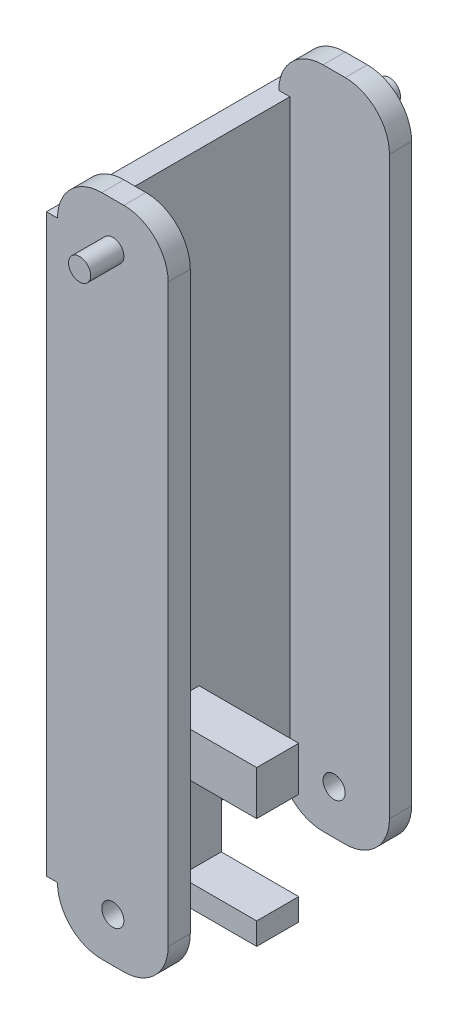
ISO-10303-21;
HEADER;
FILE_DESCRIPTION(('STEP AP214'),'2;1');
FILE_NAME('part.step','',(''),(''),'','','');
FILE_SCHEMA(('AUTOMOTIVE_DESIGN { 1 0 10303 214 1 1 1 1 }'));
ENDSEC;
DATA;
#1=APPLICATION_CONTEXT('core data for automotive mechanical design processes');
#2=APPLICATION_PROTOCOL_DEFINITION('international standard','automotive_design',2000,#1);
#3=PRODUCT_CONTEXT('',#1,'mechanical');
#4=PRODUCT('Part','Part','',(#3));
#5=PRODUCT_RELATED_PRODUCT_CATEGORY('part','',(#4));
#6=PRODUCT_DEFINITION_FORMATION('','',#4);
#7=PRODUCT_DEFINITION_CONTEXT('part definition',#1,'design');
#8=PRODUCT_DEFINITION('design','',#6,#7);
#9=PRODUCT_DEFINITION_SHAPE('','',#8);
#10=(LENGTH_UNIT() NAMED_UNIT(*) SI_UNIT(.MILLI.,.METRE.));
#11=(NAMED_UNIT(*) PLANE_ANGLE_UNIT() SI_UNIT($,.RADIAN.));
#12=(NAMED_UNIT(*) SI_UNIT($,.STERADIAN.) SOLID_ANGLE_UNIT());
#13=UNCERTAINTY_MEASURE_WITH_UNIT(LENGTH_MEASURE(1.E-05),#10,'distance_accuracy_value','');
#14=(GEOMETRIC_REPRESENTATION_CONTEXT(3) GLOBAL_UNCERTAINTY_ASSIGNED_CONTEXT((#13)) GLOBAL_UNIT_ASSIGNED_CONTEXT((#10,
#11,#12)) REPRESENTATION_CONTEXT('',''));
#15=CARTESIAN_POINT('',(0.,0.,0.));
#16=DIRECTION('',(0.,0.,1.));
#17=DIRECTION('',(1.,0.,0.));
#18=AXIS2_PLACEMENT_3D('',#15,#16,#17);
#19=CARTESIAN_POINT('',(-20.,0.,-45.));
#20=DIRECTION('',(-1.,0.,0.));
#21=DIRECTION('',(0.,0.,1.));
#22=AXIS2_PLACEMENT_3D('',#19,#20,#21);
#23=PLANE('',#22);
#24=DIRECTION('',(0.,0.,1.));
#25=VECTOR('',#24,1.);
#26=CARTESIAN_POINT('',(-20.,0.,-45.));
#27=LINE('',#26,#25);
#28=CARTESIAN_POINT('',(-20.,0.,-30.));
#29=VERTEX_POINT('',#28);
#30=CARTESIAN_POINT('',(-20.,0.,0.));
#31=VERTEX_POINT('',#30);
#32=EDGE_CURVE('E409',#29,#31,#27,.T.);
#33=ORIENTED_EDGE('',*,*,#32,.F.);
#34=DIRECTION('',(0.,-1.,0.));
#35=VECTOR('',#34,1.);
#36=CARTESIAN_POINT('',(-20.,30.,-30.));
#37=LINE('',#36,#35);
#38=CARTESIAN_POINT('',(-20.,50.,-30.));
#39=VERTEX_POINT('',#38);
#40=EDGE_CURVE('E276',#39,#29,#37,.T.);
#41=ORIENTED_EDGE('',*,*,#40,.F.);
#42=DIRECTION('',(0.,0.,1.));
#43=VECTOR('',#42,1.);
#44=CARTESIAN_POINT('',(-20.,50.,-30.));
#45=LINE('',#44,#43);
#46=CARTESIAN_POINT('',(-20.,50.,-49.));
#47=VERTEX_POINT('',#46);
#48=EDGE_CURVE('E56',#47,#39,#45,.T.);
#49=ORIENTED_EDGE('',*,*,#48,.F.);
#50=DIRECTION('',(0.,1.,0.));
#51=VECTOR('',#50,1.);
#52=CARTESIAN_POINT('',(-20.,50.,-49.));
#53=LINE('',#52,#51);
#54=CARTESIAN_POINT('',(-20.,0.,-49.));
#55=VERTEX_POINT('',#54);
#56=EDGE_CURVE('E271',#55,#47,#53,.T.);
#57=ORIENTED_EDGE('',*,*,#56,.F.);
#58=CARTESIAN_POINT('',(-20.,0.,-90.));
#59=VERTEX_POINT('',#58);
#60=EDGE_CURVE('E410',#59,#55,#27,.T.);
#61=ORIENTED_EDGE('',*,*,#60,.F.);
#62=DIRECTION('',(0.,-1.,0.));
#63=VECTOR('',#62,1.);
#64=CARTESIAN_POINT('',(-20.,0.,-90.));
#65=LINE('',#64,#63);
#66=CARTESIAN_POINT('',(-20.,260.,-90.));
#67=VERTEX_POINT('',#66);
#68=EDGE_CURVE('E325',#67,#59,#65,.T.);
#69=ORIENTED_EDGE('',*,*,#68,.F.);
#70=DIRECTION('',(0.,0.,1.));
#71=VECTOR('',#70,1.);
#72=CARTESIAN_POINT('',(-20.,260.,-45.));
#73=LINE('',#72,#71);
#74=CARTESIAN_POINT('',(-20.,260.,0.));
#75=VERTEX_POINT('',#74);
#76=EDGE_CURVE('E413',#67,#75,#73,.T.);
#77=ORIENTED_EDGE('',*,*,#76,.T.);
#78=DIRECTION('',(0.,-1.,0.));
#79=VECTOR('',#78,1.);
#80=CARTESIAN_POINT('',(-20.,0.,0.));
#81=LINE('',#80,#79);
#82=EDGE_CURVE('E403',#75,#31,#81,.T.);
#83=ORIENTED_EDGE('',*,*,#82,.T.);
#84=EDGE_LOOP('',(#33,#41,#49,#57,#61,#69,#77,#83));
#85=FACE_BOUND('',#84,.T.);
#86=ADVANCED_FACE('F33',(#85),#23,.F.);
#87=CARTESIAN_POINT('',(-25.,0.,-45.));
#88=DIRECTION('',(0.,1.,0.));
#89=DIRECTION('',(-1.,0.,0.));
#90=AXIS2_PLACEMENT_3D('',#87,#88,#89);
#91=PLANE('',#90);
#92=DIRECTION('',(1.,0.,0.));
#93=VECTOR('',#92,1.);
#94=CARTESIAN_POINT('',(-20.,0.,-49.));
#95=LINE('',#94,#93);
#96=CARTESIAN_POINT('',(-30.,0.,-49.));
#97=VERTEX_POINT('',#96);
#98=EDGE_CURVE('E313',#97,#55,#95,.T.);
#99=ORIENTED_EDGE('',*,*,#98,.F.);
#100=DIRECTION('',(0.,0.,1.));
#101=VECTOR('',#100,1.);
#102=CARTESIAN_POINT('',(-30.,0.,-49.));
#103=LINE('',#102,#101);
#104=CARTESIAN_POINT('',(-30.,0.,-100.));
#105=VERTEX_POINT('',#104);
#106=EDGE_CURVE('E514',#105,#97,#103,.T.);
#107=ORIENTED_EDGE('',*,*,#106,.F.);
#108=DIRECTION('',(1.,0.,0.));
#109=VECTOR('',#108,1.);
#110=CARTESIAN_POINT('',(-30.,0.,-100.));
#111=LINE('',#110,#109);
#112=CARTESIAN_POINT('',(-25.,0.,-100.));
#113=VERTEX_POINT('',#112);
#114=EDGE_CURVE('E263',#105,#113,#111,.T.);
#115=ORIENTED_EDGE('',*,*,#114,.T.);
#116=DIRECTION('',(0.,0.,1.));
#117=VECTOR('',#116,1.);
#118=CARTESIAN_POINT('',(-25.,0.,-100.));
#119=LINE('',#118,#117);
#120=CARTESIAN_POINT('',(-25.,0.,-90.));
#121=VERTEX_POINT('',#120);
#122=EDGE_CURVE('E389',#113,#121,#119,.T.);
#123=ORIENTED_EDGE('',*,*,#122,.T.);
#124=DIRECTION('',(-1.,0.,0.));
#125=VECTOR('',#124,1.);
#126=CARTESIAN_POINT('',(-25.,0.,-90.));
#127=LINE('',#126,#125);
#128=EDGE_CURVE('E328',#59,#121,#127,.T.);
#129=ORIENTED_EDGE('',*,*,#128,.F.);
#130=ORIENTED_EDGE('',*,*,#60,.T.);
#131=EDGE_LOOP('',(#99,#107,#115,#123,#129,#130));
#132=FACE_BOUND('',#131,.T.);
#133=ADVANCED_FACE('F530',(#132),#91,.F.);
#134=DIRECTION('',(-1.,0.,0.));
#135=VECTOR('',#134,1.);
#136=CARTESIAN_POINT('',(-25.,0.,-30.));
#137=LINE('',#136,#135);
#138=CARTESIAN_POINT('',(-30.,0.,-30.));
#139=VERTEX_POINT('',#138);
#140=EDGE_CURVE('E317',#29,#139,#137,.T.);
#141=ORIENTED_EDGE('',*,*,#140,.F.);
#142=ORIENTED_EDGE('',*,*,#32,.T.);
#143=DIRECTION('',(-1.,0.,0.));
#144=VECTOR('',#143,1.);
#145=CARTESIAN_POINT('',(-25.,0.,0.));
#146=LINE('',#145,#144);
#147=CARTESIAN_POINT('',(-25.,0.,0.));
#148=VERTEX_POINT('',#147);
#149=EDGE_CURVE('E406',#31,#148,#146,.T.);
#150=ORIENTED_EDGE('',*,*,#149,.T.);
#151=DIRECTION('',(0.,0.,-1.));
#152=VECTOR('',#151,1.);
#153=CARTESIAN_POINT('',(-25.,0.,10.));
#154=LINE('',#153,#152);
#155=CARTESIAN_POINT('',(-25.,0.,10.));
#156=VERTEX_POINT('',#155);
#157=EDGE_CURVE('E463',#156,#148,#154,.T.);
#158=ORIENTED_EDGE('',*,*,#157,.F.);
#159=DIRECTION('',(1.,0.,0.));
#160=VECTOR('',#159,1.);
#161=CARTESIAN_POINT('',(-30.,0.,10.));
#162=LINE('',#161,#160);
#163=CARTESIAN_POINT('',(-30.,0.,10.));
#164=VERTEX_POINT('',#163);
#165=EDGE_CURVE('E527',#164,#156,#162,.T.);
#166=ORIENTED_EDGE('',*,*,#165,.F.);
#167=DIRECTION('',(0.,0.,1.));
#168=VECTOR('',#167,1.);
#169=CARTESIAN_POINT('',(-30.,0.,10.));
#170=LINE('',#169,#168);
#171=EDGE_CURVE('E248',#139,#164,#170,.T.);
#172=ORIENTED_EDGE('',*,*,#171,.F.);
#173=EDGE_LOOP('',(#141,#142,#150,#158,#166,#172));
#174=FACE_BOUND('',#173,.T.);
#175=ADVANCED_FACE('F589',(#174),#91,.F.);
#176=CARTESIAN_POINT('',(5.,0.,0.));
#177=DIRECTION('',(0.,0.,1.));
#178=DIRECTION('',(1.,0.,0.));
#179=AXIS2_PLACEMENT_3D('',#176,#177,#178);
#180=PLANE('',#179);
#181=CARTESIAN_POINT('',(0.,0.,0.));
#182=DIRECTION('',(0.,0.,1.));
#183=DIRECTION('',(1.,0.,0.));
#184=AXIS2_PLACEMENT_3D('',#181,#182,#183);
#185=CIRCLE('',#184,5.);
#186=CARTESIAN_POINT('',(5.,0.,0.));
#187=VERTEX_POINT('',#186);
#188=EDGE_CURVE('E420',#187,#187,#185,.T.);
#189=ORIENTED_EDGE('',*,*,#188,.T.);
#190=EDGE_LOOP('',(#189));
#191=FACE_BOUND('',#190,.T.);
#192=ORIENTED_EDGE('',*,*,#149,.F.);
#193=ORIENTED_EDGE('',*,*,#82,.F.);
#194=DIRECTION('',(1.,0.,0.));
#195=VECTOR('',#194,1.);
#196=CARTESIAN_POINT('',(-20.,260.,0.));
#197=LINE('',#196,#195);
#198=CARTESIAN_POINT('',(-25.,260.,0.));
#199=VERTEX_POINT('',#198);
#200=EDGE_CURVE('E401',#199,#75,#197,.T.);
#201=ORIENTED_EDGE('',*,*,#200,.F.);
#202=CARTESIAN_POINT('',(-5.,260.,0.));
#203=DIRECTION('',(0.,0.,1.));
#204=DIRECTION('',(-1.,0.,0.));
#205=AXIS2_PLACEMENT_3D('',#202,#203,#204);
#206=CIRCLE('',#205,20.);
#207=CARTESIAN_POINT('',(-5.,280.,0.));
#208=VERTEX_POINT('',#207);
#209=EDGE_CURVE('E452',#208,#199,#206,.T.);
#210=ORIENTED_EDGE('',*,*,#209,.F.);
#211=DIRECTION('',(-1.,0.,0.));
#212=VECTOR('',#211,1.);
#213=CARTESIAN_POINT('',(-5.,280.,0.));
#214=LINE('',#213,#212);
#215=CARTESIAN_POINT('',(4.99999999999996,280.,0.));
#216=VERTEX_POINT('',#215);
#217=EDGE_CURVE('E450',#216,#208,#214,.T.);
#218=ORIENTED_EDGE('',*,*,#217,.F.);
#219=CARTESIAN_POINT('',(4.99999999999996,260.,0.));
#220=DIRECTION('',(0.,0.,1.));
#221=DIRECTION('',(-1.,0.,0.));
#222=AXIS2_PLACEMENT_3D('',#219,#220,#221);
#223=CIRCLE('',#222,20.);
#224=CARTESIAN_POINT('',(25.,260.,0.));
#225=VERTEX_POINT('',#224);
#226=EDGE_CURVE('E448',#225,#216,#223,.T.);
#227=ORIENTED_EDGE('',*,*,#226,.F.);
#228=DIRECTION('',(0.,1.,0.));
#229=VECTOR('',#228,1.);
#230=CARTESIAN_POINT('',(25.,260.,0.));
#231=LINE('',#230,#229);
#232=CARTESIAN_POINT('',(25.,0.,0.));
#233=VERTEX_POINT('',#232);
#234=EDGE_CURVE('E446',#233,#225,#231,.T.);
#235=ORIENTED_EDGE('',*,*,#234,.F.);
#236=CARTESIAN_POINT('',(5.,0.,0.));
#237=DIRECTION('',(0.,0.,1.));
#238=DIRECTION('',(1.,0.,0.));
#239=AXIS2_PLACEMENT_3D('',#236,#237,#238);
#240=CIRCLE('',#239,20.);
#241=CARTESIAN_POINT('',(5.,-20.,0.));
#242=VERTEX_POINT('',#241);
#243=EDGE_CURVE('E426',#242,#233,#240,.T.);
#244=ORIENTED_EDGE('',*,*,#243,.F.);
#245=DIRECTION('',(1.,0.,0.));
#246=VECTOR('',#245,1.);
#247=CARTESIAN_POINT('',(-5.,-20.,0.));
#248=LINE('',#247,#246);
#249=CARTESIAN_POINT('',(-5.,-20.,0.));
#250=VERTEX_POINT('',#249);
#251=EDGE_CURVE('E432',#250,#242,#248,.T.);
#252=ORIENTED_EDGE('',*,*,#251,.F.);
#253=CARTESIAN_POINT('',(-5.,0.,0.));
#254=DIRECTION('',(0.,0.,1.));
#255=DIRECTION('',(-1.,0.,0.));
#256=AXIS2_PLACEMENT_3D('',#253,#254,#255);
#257=CIRCLE('',#256,20.);
#258=EDGE_CURVE('E455',#148,#250,#257,.T.);
#259=ORIENTED_EDGE('',*,*,#258,.F.);
#260=EDGE_LOOP('',(#192,#193,#201,#210,#218,#227,#235,#244,#252,#259));
#261=FACE_BOUND('',#260,.T.);
#262=ADVANCED_FACE('F483',(#191,#261),#180,.F.);
#263=CARTESIAN_POINT('',(5.,0.,10.));
#264=DIRECTION('',(0.,0.,1.));
#265=DIRECTION('',(1.,0.,0.));
#266=AXIS2_PLACEMENT_3D('',#263,#264,#265);
#267=PLANE('',#266);
#268=CARTESIAN_POINT('',(0.,260.,10.));
#269=DIRECTION('',(0.,0.,1.));
#270=DIRECTION('',(1.,0.,0.));
#271=AXIS2_PLACEMENT_3D('',#268,#269,#270);
#272=CIRCLE('',#271,5.);
#273=CARTESIAN_POINT('',(5.00000000000001,260.,10.));
#274=VERTEX_POINT('',#273);
#275=EDGE_CURVE('E416',#274,#274,#272,.T.);
#276=ORIENTED_EDGE('',*,*,#275,.F.);
#277=EDGE_LOOP('',(#276));
#278=FACE_BOUND('',#277,.T.);
#279=CARTESIAN_POINT('',(5.,0.,10.));
#280=DIRECTION('',(0.,0.,1.));
#281=DIRECTION('',(1.,0.,0.));
#282=AXIS2_PLACEMENT_3D('',#279,#280,#281);
#283=CIRCLE('',#282,20.);
#284=CARTESIAN_POINT('',(5.,-20.,10.));
#285=VERTEX_POINT('',#284);
#286=CARTESIAN_POINT('',(25.,0.,10.));
#287=VERTEX_POINT('',#286);
#288=EDGE_CURVE('E429',#285,#287,#283,.T.);
#289=ORIENTED_EDGE('',*,*,#288,.T.);
#290=DIRECTION('',(0.,1.,0.));
#291=VECTOR('',#290,1.);
#292=CARTESIAN_POINT('',(25.,260.,10.));
#293=LINE('',#292,#291);
#294=CARTESIAN_POINT('',(25.,260.,10.));
#295=VERTEX_POINT('',#294);
#296=EDGE_CURVE('E431',#287,#295,#293,.T.);
#297=ORIENTED_EDGE('',*,*,#296,.T.);
#298=CARTESIAN_POINT('',(4.99999999999996,260.,10.));
#299=DIRECTION('',(0.,0.,1.));
#300=DIRECTION('',(-1.,0.,0.));
#301=AXIS2_PLACEMENT_3D('',#298,#299,#300);
#302=CIRCLE('',#301,20.);
#303=CARTESIAN_POINT('',(4.99999999999996,280.,10.));
#304=VERTEX_POINT('',#303);
#305=EDGE_CURVE('E434',#295,#304,#302,.T.);
#306=ORIENTED_EDGE('',*,*,#305,.T.);
#307=DIRECTION('',(-1.,0.,0.));
#308=VECTOR('',#307,1.);
#309=CARTESIAN_POINT('',(-5.,280.,10.));
#310=LINE('',#309,#308);
#311=CARTESIAN_POINT('',(-5.,280.,10.));
#312=VERTEX_POINT('',#311);
#313=EDGE_CURVE('E436',#304,#312,#310,.T.);
#314=ORIENTED_EDGE('',*,*,#313,.T.);
#315=CARTESIAN_POINT('',(-5.,260.,10.));
#316=DIRECTION('',(0.,0.,1.));
#317=DIRECTION('',(-1.,0.,0.));
#318=AXIS2_PLACEMENT_3D('',#315,#316,#317);
#319=CIRCLE('',#318,20.);
#320=CARTESIAN_POINT('',(-25.,260.,10.));
#321=VERTEX_POINT('',#320);
#322=EDGE_CURVE('E257',#312,#321,#319,.T.);
#323=ORIENTED_EDGE('',*,*,#322,.T.);
#324=DIRECTION('',(1.,0.,0.));
#325=VECTOR('',#324,1.);
#326=CARTESIAN_POINT('',(-30.,260.,10.));
#327=LINE('',#326,#325);
#328=CARTESIAN_POINT('',(-30.,260.,10.));
#329=VERTEX_POINT('',#328);
#330=EDGE_CURVE('E235',#329,#321,#327,.T.);
#331=ORIENTED_EDGE('',*,*,#330,.F.);
#332=DIRECTION('',(0.,1.,0.));
#333=VECTOR('',#332,1.);
#334=CARTESIAN_POINT('',(-30.,260.,10.));
#335=LINE('',#334,#333);
#336=EDGE_CURVE('E242',#164,#329,#335,.T.);
#337=ORIENTED_EDGE('',*,*,#336,.F.);
#338=ORIENTED_EDGE('',*,*,#165,.T.);
#339=CARTESIAN_POINT('',(-5.,0.,10.));
#340=DIRECTION('',(0.,0.,1.));
#341=DIRECTION('',(-1.,0.,0.));
#342=AXIS2_PLACEMENT_3D('',#339,#340,#341);
#343=CIRCLE('',#342,20.);
#344=CARTESIAN_POINT('',(-5.,-20.,10.));
#345=VERTEX_POINT('',#344);
#346=EDGE_CURVE('E439',#156,#345,#343,.T.);
#347=ORIENTED_EDGE('',*,*,#346,.T.);
#348=DIRECTION('',(1.,0.,0.));
#349=VECTOR('',#348,1.);
#350=CARTESIAN_POINT('',(-5.,-20.,10.));
#351=LINE('',#350,#349);
#352=EDGE_CURVE('E441',#345,#285,#351,.T.);
#353=ORIENTED_EDGE('',*,*,#352,.T.);
#354=EDGE_LOOP('',(#289,#297,#306,#314,#323,#331,#337,#338,#347,#353));
#355=FACE_BOUND('',#354,.T.);
#356=CARTESIAN_POINT('',(0.,0.,10.));
#357=DIRECTION('',(0.,0.,1.));
#358=DIRECTION('',(1.,0.,0.));
#359=AXIS2_PLACEMENT_3D('',#356,#357,#358);
#360=CIRCLE('',#359,5.);
#361=CARTESIAN_POINT('',(5.,0.,10.));
#362=VERTEX_POINT('',#361);
#363=EDGE_CURVE('E423',#362,#362,#360,.T.);
#364=ORIENTED_EDGE('',*,*,#363,.F.);
#365=EDGE_LOOP('',(#364));
#366=FACE_BOUND('',#365,.T.);
#367=ADVANCED_FACE('F254',(#278,#355,#366),#267,.T.);
#368=CARTESIAN_POINT('',(5.,0.,10.));
#369=DIRECTION('',(0.,0.,-1.));
#370=DIRECTION('',(-1.,0.,0.));
#371=AXIS2_PLACEMENT_3D('',#368,#369,#370);
#372=CYLINDRICAL_SURFACE('',#371,20.);
#373=ORIENTED_EDGE('',*,*,#243,.T.);
#374=DIRECTION('',(0.,0.,-1.));
#375=VECTOR('',#374,1.);
#376=CARTESIAN_POINT('',(25.,0.,10.));
#377=LINE('',#376,#375);
#378=EDGE_CURVE('E11',#287,#233,#377,.T.);
#379=ORIENTED_EDGE('',*,*,#378,.F.);
#380=ORIENTED_EDGE('',*,*,#288,.F.);
#381=DIRECTION('',(0.,0.,-1.));
#382=VECTOR('',#381,1.);
#383=CARTESIAN_POINT('',(5.,-20.,10.));
#384=LINE('',#383,#382);
#385=EDGE_CURVE('E443',#285,#242,#384,.T.);
#386=ORIENTED_EDGE('',*,*,#385,.T.);
#387=EDGE_LOOP('',(#373,#379,#380,#386));
#388=FACE_BOUND('',#387,.T.);
#389=ADVANCED_FACE('F35',(#388),#372,.T.);
#390=CARTESIAN_POINT('',(25.,260.,10.));
#391=DIRECTION('',(-1.,0.,0.));
#392=DIRECTION('',(0.,-1.,0.));
#393=AXIS2_PLACEMENT_3D('',#390,#391,#392);
#394=PLANE('',#393);
#395=ORIENTED_EDGE('',*,*,#234,.T.);
#396=DIRECTION('',(0.,0.,-1.));
#397=VECTOR('',#396,1.);
#398=CARTESIAN_POINT('',(25.,260.,10.));
#399=LINE('',#398,#397);
#400=EDGE_CURVE('E41',#295,#225,#399,.T.);
#401=ORIENTED_EDGE('',*,*,#400,.F.);
#402=ORIENTED_EDGE('',*,*,#296,.F.);
#403=ORIENTED_EDGE('',*,*,#378,.T.);
#404=EDGE_LOOP('',(#395,#401,#402,#403));
#405=FACE_BOUND('',#404,.T.);
#406=ADVANCED_FACE('F626',(#405),#394,.F.);
#407=CARTESIAN_POINT('',(4.99999999999996,260.,10.));
#408=DIRECTION('',(0.,0.,-1.));
#409=DIRECTION('',(-1.,0.,0.));
#410=AXIS2_PLACEMENT_3D('',#407,#408,#409);
#411=CYLINDRICAL_SURFACE('',#410,20.);
#412=ORIENTED_EDGE('',*,*,#226,.T.);
#413=DIRECTION('',(0.,0.,-1.));
#414=VECTOR('',#413,1.);
#415=CARTESIAN_POINT('',(4.99999999999996,280.,10.));
#416=LINE('',#415,#414);
#417=EDGE_CURVE('E470',#304,#216,#416,.T.);
#418=ORIENTED_EDGE('',*,*,#417,.F.);
#419=ORIENTED_EDGE('',*,*,#305,.F.);
#420=ORIENTED_EDGE('',*,*,#400,.T.);
#421=EDGE_LOOP('',(#412,#418,#419,#420));
#422=FACE_BOUND('',#421,.T.);
#423=ADVANCED_FACE('F477',(#422),#411,.T.);
#424=CARTESIAN_POINT('',(-5.,280.,10.));
#425=DIRECTION('',(0.,-1.,0.));
#426=DIRECTION('',(0.,0.,-1.));
#427=AXIS2_PLACEMENT_3D('',#424,#425,#426);
#428=PLANE('',#427);
#429=ORIENTED_EDGE('',*,*,#217,.T.);
#430=DIRECTION('',(0.,0.,-1.));
#431=VECTOR('',#430,1.);
#432=CARTESIAN_POINT('',(-5.,280.,10.));
#433=LINE('',#432,#431);
#434=EDGE_CURVE('E467',#312,#208,#433,.T.);
#435=ORIENTED_EDGE('',*,*,#434,.F.);
#436=ORIENTED_EDGE('',*,*,#313,.F.);
#437=ORIENTED_EDGE('',*,*,#417,.T.);
#438=EDGE_LOOP('',(#429,#435,#436,#437));
#439=FACE_BOUND('',#438,.T.);
#440=ADVANCED_FACE('F489',(#439),#428,.F.);
#441=CARTESIAN_POINT('',(-5.,260.,10.));
#442=DIRECTION('',(0.,0.,-1.));
#443=DIRECTION('',(-1.,0.,0.));
#444=AXIS2_PLACEMENT_3D('',#441,#442,#443);
#445=CYLINDRICAL_SURFACE('',#444,20.);
#446=ORIENTED_EDGE('',*,*,#209,.T.);
#447=DIRECTION('',(0.,0.,-1.));
#448=VECTOR('',#447,1.);
#449=CARTESIAN_POINT('',(-25.,260.,10.));
#450=LINE('',#449,#448);
#451=EDGE_CURVE('E465',#321,#199,#450,.T.);
#452=ORIENTED_EDGE('',*,*,#451,.F.);
#453=ORIENTED_EDGE('',*,*,#322,.F.);
#454=ORIENTED_EDGE('',*,*,#434,.T.);
#455=EDGE_LOOP('',(#446,#452,#453,#454));
#456=FACE_BOUND('',#455,.T.);
#457=ADVANCED_FACE('F492',(#456),#445,.T.);
#458=CARTESIAN_POINT('',(-5.,0.,10.));
#459=DIRECTION('',(0.,0.,-1.));
#460=DIRECTION('',(-1.,0.,0.));
#461=AXIS2_PLACEMENT_3D('',#458,#459,#460);
#462=CYLINDRICAL_SURFACE('',#461,20.);
#463=ORIENTED_EDGE('',*,*,#258,.T.);
#464=DIRECTION('',(0.,0.,-1.));
#465=VECTOR('',#464,1.);
#466=CARTESIAN_POINT('',(-5.,-20.,10.));
#467=LINE('',#466,#465);
#468=EDGE_CURVE('E460',#345,#250,#467,.T.);
#469=ORIENTED_EDGE('',*,*,#468,.F.);
#470=ORIENTED_EDGE('',*,*,#346,.F.);
#471=ORIENTED_EDGE('',*,*,#157,.T.);
#472=EDGE_LOOP('',(#463,#469,#470,#471));
#473=FACE_BOUND('',#472,.T.);
#474=ADVANCED_FACE('F616',(#473),#462,.T.);
#475=CARTESIAN_POINT('',(-5.,-20.,10.));
#476=DIRECTION('',(0.,1.,0.));
#477=DIRECTION('',(-1.,0.,0.));
#478=AXIS2_PLACEMENT_3D('',#475,#476,#477);
#479=PLANE('',#478);
#480=ORIENTED_EDGE('',*,*,#251,.T.);
#481=ORIENTED_EDGE('',*,*,#385,.F.);
#482=ORIENTED_EDGE('',*,*,#352,.F.);
#483=ORIENTED_EDGE('',*,*,#468,.T.);
#484=EDGE_LOOP('',(#480,#481,#482,#483));
#485=FACE_BOUND('',#484,.T.);
#486=ADVANCED_FACE('F606',(#485),#479,.F.);
#487=CARTESIAN_POINT('',(0.,0.,10.));
#488=DIRECTION('',(0.,0.,-1.));
#489=DIRECTION('',(-1.,0.,0.));
#490=AXIS2_PLACEMENT_3D('',#487,#488,#489);
#491=CYLINDRICAL_SURFACE('',#490,5.);
#492=ORIENTED_EDGE('',*,*,#363,.T.);
#493=EDGE_LOOP('',(#492));
#494=FACE_BOUND('',#493,.T.);
#495=ORIENTED_EDGE('',*,*,#188,.F.);
#496=EDGE_LOOP('',(#495));
#497=FACE_BOUND('',#496,.T.);
#498=ADVANCED_FACE('F602',(#494,#497),#491,.F.);
#499=CARTESIAN_POINT('',(0.,260.,25.));
#500=DIRECTION('',(0.,0.,-1.));
#501=DIRECTION('',(-1.,0.,0.));
#502=AXIS2_PLACEMENT_3D('',#499,#500,#501);
#503=CYLINDRICAL_SURFACE('',#502,5.);
#504=CARTESIAN_POINT('',(0.,260.,25.));
#505=DIRECTION('',(0.,0.,1.));
#506=DIRECTION('',(1.,0.,0.));
#507=AXIS2_PLACEMENT_3D('',#504,#505,#506);
#508=CIRCLE('',#507,5.);
#509=CARTESIAN_POINT('',(5.00000000000001,260.,25.));
#510=VERTEX_POINT('',#509);
#511=EDGE_CURVE('E417',#510,#510,#508,.T.);
#512=ORIENTED_EDGE('',*,*,#511,.F.);
#513=EDGE_LOOP('',(#512));
#514=FACE_BOUND('',#513,.T.);
#515=ORIENTED_EDGE('',*,*,#275,.T.);
#516=EDGE_LOOP('',(#515));
#517=FACE_BOUND('',#516,.T.);
#518=ADVANCED_FACE('F598',(#514,#517),#503,.T.);
#519=CARTESIAN_POINT('',(0.,260.,25.));
#520=DIRECTION('',(0.,0.,1.));
#521=DIRECTION('',(1.,0.,0.));
#522=AXIS2_PLACEMENT_3D('',#519,#520,#521);
#523=PLANE('',#522);
#524=ORIENTED_EDGE('',*,*,#511,.T.);
#525=EDGE_LOOP('',(#524));
#526=FACE_BOUND('',#525,.T.);
#527=ADVANCED_FACE('F595',(#526),#523,.T.);
#528=CARTESIAN_POINT('',(-20.,260.,-45.));
#529=DIRECTION('',(0.,-1.,0.));
#530=DIRECTION('',(1.,0.,0.));
#531=AXIS2_PLACEMENT_3D('',#528,#529,#530);
#532=PLANE('',#531);
#533=ORIENTED_EDGE('',*,*,#200,.T.);
#534=ORIENTED_EDGE('',*,*,#76,.F.);
#535=DIRECTION('',(1.,0.,0.));
#536=VECTOR('',#535,1.);
#537=CARTESIAN_POINT('',(-20.,260.,-90.));
#538=LINE('',#537,#536);
#539=CARTESIAN_POINT('',(-25.,260.,-90.));
#540=VERTEX_POINT('',#539);
#541=EDGE_CURVE('E319',#540,#67,#538,.T.);
#542=ORIENTED_EDGE('',*,*,#541,.F.);
#543=DIRECTION('',(0.,0.,1.));
#544=VECTOR('',#543,1.);
#545=CARTESIAN_POINT('',(-25.,260.,-100.));
#546=LINE('',#545,#544);
#547=CARTESIAN_POINT('',(-25.,260.,-100.));
#548=VERTEX_POINT('',#547);
#549=EDGE_CURVE('E391',#548,#540,#546,.T.);
#550=ORIENTED_EDGE('',*,*,#549,.F.);
#551=DIRECTION('',(1.,0.,0.));
#552=VECTOR('',#551,1.);
#553=CARTESIAN_POINT('',(-30.,260.,-100.));
#554=LINE('',#553,#552);
#555=CARTESIAN_POINT('',(-30.,260.,-100.));
#556=VERTEX_POINT('',#555);
#557=EDGE_CURVE('E238',#556,#548,#554,.T.);
#558=ORIENTED_EDGE('',*,*,#557,.F.);
#559=DIRECTION('',(0.,0.,-1.));
#560=VECTOR('',#559,1.);
#561=CARTESIAN_POINT('',(-30.,260.,-100.));
#562=LINE('',#561,#560);
#563=EDGE_CURVE('E230',#329,#556,#562,.T.);
#564=ORIENTED_EDGE('',*,*,#563,.F.);
#565=ORIENTED_EDGE('',*,*,#330,.T.);
#566=ORIENTED_EDGE('',*,*,#451,.T.);
#567=EDGE_LOOP('',(#533,#534,#542,#550,#558,#564,#565,#566));
#568=FACE_BOUND('',#567,.T.);
#569=ADVANCED_FACE('F233',(#568),#532,.F.);
#570=CARTESIAN_POINT('',(5.,0.,-90.));
#571=DIRECTION('',(0.,0.,-1.));
#572=DIRECTION('',(1.,0.,0.));
#573=AXIS2_PLACEMENT_3D('',#570,#571,#572);
#574=PLANE('',#573);
#575=CARTESIAN_POINT('',(0.,0.,-90.));
#576=DIRECTION('',(0.,0.,1.));
#577=DIRECTION('',(1.,0.,0.));
#578=AXIS2_PLACEMENT_3D('',#575,#576,#577);
#579=CIRCLE('',#578,5.);
#580=CARTESIAN_POINT('',(5.,0.,-90.));
#581=VERTEX_POINT('',#580);
#582=EDGE_CURVE('E335',#581,#581,#579,.T.);
#583=ORIENTED_EDGE('',*,*,#582,.F.);
#584=EDGE_LOOP('',(#583));
#585=FACE_BOUND('',#584,.T.);
#586=ORIENTED_EDGE('',*,*,#128,.T.);
#587=CARTESIAN_POINT('',(-5.,0.,-90.));
#588=DIRECTION('',(0.,0.,1.));
#589=DIRECTION('',(-1.,0.,0.));
#590=AXIS2_PLACEMENT_3D('',#587,#588,#589);
#591=CIRCLE('',#590,20.);
#592=CARTESIAN_POINT('',(-5.,-20.,-90.));
#593=VERTEX_POINT('',#592);
#594=EDGE_CURVE('E381',#121,#593,#591,.T.);
#595=ORIENTED_EDGE('',*,*,#594,.T.);
#596=DIRECTION('',(1.,0.,0.));
#597=VECTOR('',#596,1.);
#598=CARTESIAN_POINT('',(-5.,-20.,-90.));
#599=LINE('',#598,#597);
#600=CARTESIAN_POINT('',(5.,-20.,-90.));
#601=VERTEX_POINT('',#600);
#602=EDGE_CURVE('E348',#593,#601,#599,.T.);
#603=ORIENTED_EDGE('',*,*,#602,.T.);
#604=CARTESIAN_POINT('',(5.,0.,-90.));
#605=DIRECTION('',(0.,0.,1.));
#606=DIRECTION('',(1.,0.,0.));
#607=AXIS2_PLACEMENT_3D('',#604,#605,#606);
#608=CIRCLE('',#607,20.);
#609=CARTESIAN_POINT('',(25.,0.,-90.));
#610=VERTEX_POINT('',#609);
#611=EDGE_CURVE('E341',#601,#610,#608,.T.);
#612=ORIENTED_EDGE('',*,*,#611,.T.);
#613=DIRECTION('',(0.,1.,0.));
#614=VECTOR('',#613,1.);
#615=CARTESIAN_POINT('',(25.,260.,-90.));
#616=LINE('',#615,#614);
#617=CARTESIAN_POINT('',(25.,260.,-90.));
#618=VERTEX_POINT('',#617);
#619=EDGE_CURVE('E369',#610,#618,#616,.T.);
#620=ORIENTED_EDGE('',*,*,#619,.T.);
#621=CARTESIAN_POINT('',(4.99999999999996,260.,-90.));
#622=DIRECTION('',(0.,0.,1.));
#623=DIRECTION('',(-1.,0.,0.));
#624=AXIS2_PLACEMENT_3D('',#621,#622,#623);
#625=CIRCLE('',#624,20.);
#626=CARTESIAN_POINT('',(4.99999999999996,280.,-90.));
#627=VERTEX_POINT('',#626);
#628=EDGE_CURVE('E372',#618,#627,#625,.T.);
#629=ORIENTED_EDGE('',*,*,#628,.T.);
#630=DIRECTION('',(-1.,0.,0.));
#631=VECTOR('',#630,1.);
#632=CARTESIAN_POINT('',(-5.,280.,-90.));
#633=LINE('',#632,#631);
#634=CARTESIAN_POINT('',(-5.,280.,-90.));
#635=VERTEX_POINT('',#634);
#636=EDGE_CURVE('E375',#627,#635,#633,.T.);
#637=ORIENTED_EDGE('',*,*,#636,.T.);
#638=CARTESIAN_POINT('',(-5.,260.,-90.));
#639=DIRECTION('',(0.,0.,1.));
#640=DIRECTION('',(-1.,0.,0.));
#641=AXIS2_PLACEMENT_3D('',#638,#639,#640);
#642=CIRCLE('',#641,20.);
#643=EDGE_CURVE('E378',#635,#540,#642,.T.);
#644=ORIENTED_EDGE('',*,*,#643,.T.);
#645=ORIENTED_EDGE('',*,*,#541,.T.);
#646=ORIENTED_EDGE('',*,*,#68,.T.);
#647=EDGE_LOOP('',(#586,#595,#603,#612,#620,#629,#637,#644,#645,#646));
#648=FACE_BOUND('',#647,.T.);
#649=ADVANCED_FACE('F499',(#585,#648),#574,.F.);
#650=CARTESIAN_POINT('',(5.,0.,-100.));
#651=DIRECTION('',(0.,0.,-1.));
#652=DIRECTION('',(1.,0.,0.));
#653=AXIS2_PLACEMENT_3D('',#650,#651,#652);
#654=PLANE('',#653);
#655=CARTESIAN_POINT('',(0.,260.,-100.));
#656=DIRECTION('',(0.,0.,1.));
#657=DIRECTION('',(1.,0.,0.));
#658=AXIS2_PLACEMENT_3D('',#655,#656,#657);
#659=CIRCLE('',#658,5.);
#660=CARTESIAN_POINT('',(5.00000000000001,260.,-100.));
#661=VERTEX_POINT('',#660);
#662=EDGE_CURVE('E331',#661,#661,#659,.T.);
#663=ORIENTED_EDGE('',*,*,#662,.T.);
#664=EDGE_LOOP('',(#663));
#665=FACE_BOUND('',#664,.T.);
#666=CARTESIAN_POINT('',(5.,0.,-100.));
#667=DIRECTION('',(0.,0.,1.));
#668=DIRECTION('',(1.,0.,0.));
#669=AXIS2_PLACEMENT_3D('',#666,#667,#668);
#670=CIRCLE('',#669,20.);
#671=CARTESIAN_POINT('',(5.,-20.,-100.));
#672=VERTEX_POINT('',#671);
#673=CARTESIAN_POINT('',(25.,0.,-100.));
#674=VERTEX_POINT('',#673);
#675=EDGE_CURVE('E344',#672,#674,#670,.T.);
#676=ORIENTED_EDGE('',*,*,#675,.F.);
#677=DIRECTION('',(1.,0.,0.));
#678=VECTOR('',#677,1.);
#679=CARTESIAN_POINT('',(-5.,-20.,-100.));
#680=LINE('',#679,#678);
#681=CARTESIAN_POINT('',(-5.,-20.,-100.));
#682=VERTEX_POINT('',#681);
#683=EDGE_CURVE('E363',#682,#672,#680,.T.);
#684=ORIENTED_EDGE('',*,*,#683,.F.);
#685=CARTESIAN_POINT('',(-5.,0.,-100.));
#686=DIRECTION('',(0.,0.,1.));
#687=DIRECTION('',(-1.,0.,0.));
#688=AXIS2_PLACEMENT_3D('',#685,#686,#687);
#689=CIRCLE('',#688,20.);
#690=EDGE_CURVE('E360',#113,#682,#689,.T.);
#691=ORIENTED_EDGE('',*,*,#690,.F.);
#692=ORIENTED_EDGE('',*,*,#114,.F.);
#693=DIRECTION('',(0.,-1.,0.));
#694=VECTOR('',#693,1.);
#695=CARTESIAN_POINT('',(-30.,0.,-100.));
#696=LINE('',#695,#694);
#697=EDGE_CURVE('E241',#556,#105,#696,.T.);
#698=ORIENTED_EDGE('',*,*,#697,.F.);
#699=ORIENTED_EDGE('',*,*,#557,.T.);
#700=CARTESIAN_POINT('',(-5.,260.,-100.));
#701=DIRECTION('',(0.,0.,1.));
#702=DIRECTION('',(-1.,0.,0.));
#703=AXIS2_PLACEMENT_3D('',#700,#701,#702);
#704=CIRCLE('',#703,20.);
#705=CARTESIAN_POINT('',(-5.,280.,-100.));
#706=VERTEX_POINT('',#705);
#707=EDGE_CURVE('E357',#706,#548,#704,.T.);
#708=ORIENTED_EDGE('',*,*,#707,.F.);
#709=DIRECTION('',(-1.,0.,0.));
#710=VECTOR('',#709,1.);
#711=CARTESIAN_POINT('',(-5.,280.,-100.));
#712=LINE('',#711,#710);
#713=CARTESIAN_POINT('',(4.99999999999996,280.,-100.));
#714=VERTEX_POINT('',#713);
#715=EDGE_CURVE('E354',#714,#706,#712,.T.);
#716=ORIENTED_EDGE('',*,*,#715,.F.);
#717=CARTESIAN_POINT('',(4.99999999999996,260.,-100.));
#718=DIRECTION('',(0.,0.,1.));
#719=DIRECTION('',(-1.,0.,0.));
#720=AXIS2_PLACEMENT_3D('',#717,#718,#719);
#721=CIRCLE('',#720,20.);
#722=CARTESIAN_POINT('',(25.,260.,-100.));
#723=VERTEX_POINT('',#722);
#724=EDGE_CURVE('E351',#723,#714,#721,.T.);
#725=ORIENTED_EDGE('',*,*,#724,.F.);
#726=DIRECTION('',(0.,1.,0.));
#727=VECTOR('',#726,1.);
#728=CARTESIAN_POINT('',(25.,260.,-100.));
#729=LINE('',#728,#727);
#730=EDGE_CURVE('E347',#674,#723,#729,.T.);
#731=ORIENTED_EDGE('',*,*,#730,.F.);
#732=EDGE_LOOP('',(#676,#684,#691,#692,#698,#699,#708,#716,#725,#731));
#733=FACE_BOUND('',#732,.T.);
#734=CARTESIAN_POINT('',(0.,0.,-100.));
#735=DIRECTION('',(0.,0.,1.));
#736=DIRECTION('',(1.,0.,0.));
#737=AXIS2_PLACEMENT_3D('',#734,#735,#736);
#738=CIRCLE('',#737,5.);
#739=CARTESIAN_POINT('',(5.,0.,-100.));
#740=VERTEX_POINT('',#739);
#741=EDGE_CURVE('E338',#740,#740,#738,.T.);
#742=ORIENTED_EDGE('',*,*,#741,.T.);
#743=EDGE_LOOP('',(#742));
#744=FACE_BOUND('',#743,.T.);
#745=ADVANCED_FACE('F507',(#665,#733,#744),#654,.T.);
#746=CARTESIAN_POINT('',(5.,0.,-100.));
#747=DIRECTION('',(0.,0.,1.));
#748=DIRECTION('',(-1.,0.,0.));
#749=AXIS2_PLACEMENT_3D('',#746,#747,#748);
#750=CYLINDRICAL_SURFACE('',#749,20.);
#751=ORIENTED_EDGE('',*,*,#611,.F.);
#752=DIRECTION('',(0.,0.,1.));
#753=VECTOR('',#752,1.);
#754=CARTESIAN_POINT('',(5.,-20.,-100.));
#755=LINE('',#754,#753);
#756=EDGE_CURVE('E366',#672,#601,#755,.T.);
#757=ORIENTED_EDGE('',*,*,#756,.F.);
#758=ORIENTED_EDGE('',*,*,#675,.T.);
#759=DIRECTION('',(0.,0.,1.));
#760=VECTOR('',#759,1.);
#761=CARTESIAN_POINT('',(25.,0.,-100.));
#762=LINE('',#761,#760);
#763=EDGE_CURVE('E399',#674,#610,#762,.T.);
#764=ORIENTED_EDGE('',*,*,#763,.T.);
#765=EDGE_LOOP('',(#751,#757,#758,#764));
#766=FACE_BOUND('',#765,.T.);
#767=ADVANCED_FACE('F706',(#766),#750,.T.);
#768=CARTESIAN_POINT('',(25.,260.,-100.));
#769=DIRECTION('',(-1.,0.,0.));
#770=DIRECTION('',(0.,-1.,0.));
#771=AXIS2_PLACEMENT_3D('',#768,#769,#770);
#772=PLANE('',#771);
#773=ORIENTED_EDGE('',*,*,#619,.F.);
#774=ORIENTED_EDGE('',*,*,#763,.F.);
#775=ORIENTED_EDGE('',*,*,#730,.T.);
#776=DIRECTION('',(0.,0.,1.));
#777=VECTOR('',#776,1.);
#778=CARTESIAN_POINT('',(25.,260.,-100.));
#779=LINE('',#778,#777);
#780=EDGE_CURVE('E397',#723,#618,#779,.T.);
#781=ORIENTED_EDGE('',*,*,#780,.T.);
#782=EDGE_LOOP('',(#773,#774,#775,#781));
#783=FACE_BOUND('',#782,.T.);
#784=ADVANCED_FACE('F711',(#783),#772,.F.);
#785=CARTESIAN_POINT('',(4.99999999999996,260.,-100.));
#786=DIRECTION('',(0.,0.,1.));
#787=DIRECTION('',(-1.,0.,0.));
#788=AXIS2_PLACEMENT_3D('',#785,#786,#787);
#789=CYLINDRICAL_SURFACE('',#788,20.);
#790=ORIENTED_EDGE('',*,*,#628,.F.);
#791=ORIENTED_EDGE('',*,*,#780,.F.);
#792=ORIENTED_EDGE('',*,*,#724,.T.);
#793=DIRECTION('',(0.,0.,1.));
#794=VECTOR('',#793,1.);
#795=CARTESIAN_POINT('',(4.99999999999996,280.,-100.));
#796=LINE('',#795,#794);
#797=EDGE_CURVE('E395',#714,#627,#796,.T.);
#798=ORIENTED_EDGE('',*,*,#797,.T.);
#799=EDGE_LOOP('',(#790,#791,#792,#798));
#800=FACE_BOUND('',#799,.T.);
#801=ADVANCED_FACE('F722',(#800),#789,.T.);
#802=CARTESIAN_POINT('',(-5.,280.,-100.));
#803=DIRECTION('',(0.,-1.,0.));
#804=DIRECTION('',(0.,0.,1.));
#805=AXIS2_PLACEMENT_3D('',#802,#803,#804);
#806=PLANE('',#805);
#807=ORIENTED_EDGE('',*,*,#636,.F.);
#808=ORIENTED_EDGE('',*,*,#797,.F.);
#809=ORIENTED_EDGE('',*,*,#715,.T.);
#810=DIRECTION('',(0.,0.,1.));
#811=VECTOR('',#810,1.);
#812=CARTESIAN_POINT('',(-5.,280.,-100.));
#813=LINE('',#812,#811);
#814=EDGE_CURVE('E393',#706,#635,#813,.T.);
#815=ORIENTED_EDGE('',*,*,#814,.T.);
#816=EDGE_LOOP('',(#807,#808,#809,#815));
#817=FACE_BOUND('',#816,.T.);
#818=ADVANCED_FACE('F732',(#817),#806,.F.);
#819=CARTESIAN_POINT('',(-5.,260.,-100.));
#820=DIRECTION('',(0.,0.,1.));
#821=DIRECTION('',(-1.,0.,0.));
#822=AXIS2_PLACEMENT_3D('',#819,#820,#821);
#823=CYLINDRICAL_SURFACE('',#822,20.);
#824=ORIENTED_EDGE('',*,*,#643,.F.);
#825=ORIENTED_EDGE('',*,*,#814,.F.);
#826=ORIENTED_EDGE('',*,*,#707,.T.);
#827=ORIENTED_EDGE('',*,*,#549,.T.);
#828=EDGE_LOOP('',(#824,#825,#826,#827));
#829=FACE_BOUND('',#828,.T.);
#830=ADVANCED_FACE('F502',(#829),#823,.T.);
#831=CARTESIAN_POINT('',(-5.,0.,-100.));
#832=DIRECTION('',(0.,0.,1.));
#833=DIRECTION('',(-1.,0.,0.));
#834=AXIS2_PLACEMENT_3D('',#831,#832,#833);
#835=CYLINDRICAL_SURFACE('',#834,20.);
#836=ORIENTED_EDGE('',*,*,#594,.F.);
#837=ORIENTED_EDGE('',*,*,#122,.F.);
#838=ORIENTED_EDGE('',*,*,#690,.T.);
#839=DIRECTION('',(0.,0.,1.));
#840=VECTOR('',#839,1.);
#841=CARTESIAN_POINT('',(-5.,-20.,-100.));
#842=LINE('',#841,#840);
#843=EDGE_CURVE('E387',#682,#593,#842,.T.);
#844=ORIENTED_EDGE('',*,*,#843,.T.);
#845=EDGE_LOOP('',(#836,#837,#838,#844));
#846=FACE_BOUND('',#845,.T.);
#847=ADVANCED_FACE('F534',(#846),#835,.T.);
#848=CARTESIAN_POINT('',(-5.,-20.,-100.));
#849=DIRECTION('',(0.,1.,0.));
#850=DIRECTION('',(-1.,0.,0.));
#851=AXIS2_PLACEMENT_3D('',#848,#849,#850);
#852=PLANE('',#851);
#853=ORIENTED_EDGE('',*,*,#602,.F.);
#854=ORIENTED_EDGE('',*,*,#843,.F.);
#855=ORIENTED_EDGE('',*,*,#683,.T.);
#856=ORIENTED_EDGE('',*,*,#756,.T.);
#857=EDGE_LOOP('',(#853,#854,#855,#856));
#858=FACE_BOUND('',#857,.T.);
#859=ADVANCED_FACE('F539',(#858),#852,.F.);
#860=CARTESIAN_POINT('',(0.,0.,-100.));
#861=DIRECTION('',(0.,0.,1.));
#862=DIRECTION('',(-1.,0.,0.));
#863=AXIS2_PLACEMENT_3D('',#860,#861,#862);
#864=CYLINDRICAL_SURFACE('',#863,5.);
#865=ORIENTED_EDGE('',*,*,#741,.F.);
#866=EDGE_LOOP('',(#865));
#867=FACE_BOUND('',#866,.T.);
#868=ORIENTED_EDGE('',*,*,#582,.T.);
#869=EDGE_LOOP('',(#868));
#870=FACE_BOUND('',#869,.T.);
#871=ADVANCED_FACE('F753',(#867,#870),#864,.F.);
#872=CARTESIAN_POINT('',(0.,260.,-115.));
#873=DIRECTION('',(0.,0.,1.));
#874=DIRECTION('',(-1.,0.,0.));
#875=AXIS2_PLACEMENT_3D('',#872,#873,#874);
#876=CYLINDRICAL_SURFACE('',#875,5.);
#877=CARTESIAN_POINT('',(0.,260.,-115.));
#878=DIRECTION('',(0.,0.,1.));
#879=DIRECTION('',(1.,0.,0.));
#880=AXIS2_PLACEMENT_3D('',#877,#878,#879);
#881=CIRCLE('',#880,5.);
#882=CARTESIAN_POINT('',(5.00000000000001,260.,-115.));
#883=VERTEX_POINT('',#882);
#884=EDGE_CURVE('E332',#883,#883,#881,.T.);
#885=ORIENTED_EDGE('',*,*,#884,.T.);
#886=EDGE_LOOP('',(#885));
#887=FACE_BOUND('',#886,.T.);
#888=ORIENTED_EDGE('',*,*,#662,.F.);
#889=EDGE_LOOP('',(#888));
#890=FACE_BOUND('',#889,.T.);
#891=ADVANCED_FACE('F764',(#887,#890),#876,.T.);
#892=CARTESIAN_POINT('',(0.,260.,-115.));
#893=DIRECTION('',(0.,0.,-1.));
#894=DIRECTION('',(1.,0.,0.));
#895=AXIS2_PLACEMENT_3D('',#892,#893,#894);
#896=PLANE('',#895);
#897=ORIENTED_EDGE('',*,*,#884,.F.);
#898=EDGE_LOOP('',(#897));
#899=FACE_BOUND('',#898,.T.);
#900=ADVANCED_FACE('F774',(#899),#896,.T.);
#901=CARTESIAN_POINT('',(-20.,-20.,-49.));
#902=DIRECTION('',(0.,0.,1.));
#903=DIRECTION('',(1.,0.,0.));
#904=AXIS2_PLACEMENT_3D('',#901,#902,#903);
#905=PLANE('',#904);
#906=ORIENTED_EDGE('',*,*,#98,.T.);
#907=ORIENTED_EDGE('',*,*,#56,.T.);
#908=DIRECTION('',(-1.,0.,0.));
#909=VECTOR('',#908,1.);
#910=CARTESIAN_POINT('',(25.,50.,-49.));
#911=LINE('',#910,#909);
#912=CARTESIAN_POINT('',(25.,50.,-49.));
#913=VERTEX_POINT('',#912);
#914=EDGE_CURVE('E295',#913,#47,#911,.T.);
#915=ORIENTED_EDGE('',*,*,#914,.F.);
#916=DIRECTION('',(0.,1.,0.));
#917=VECTOR('',#916,1.);
#918=CARTESIAN_POINT('',(25.,50.,-49.));
#919=LINE('',#918,#917);
#920=CARTESIAN_POINT('',(25.,30.,-49.));
#921=VERTEX_POINT('',#920);
#922=EDGE_CURVE('E272',#921,#913,#919,.T.);
#923=ORIENTED_EDGE('',*,*,#922,.F.);
#924=DIRECTION('',(-1.,0.,0.));
#925=VECTOR('',#924,1.);
#926=CARTESIAN_POINT('',(25.,30.,-49.));
#927=LINE('',#926,#925);
#928=CARTESIAN_POINT('',(-9.99999999999998,30.,-49.));
#929=VERTEX_POINT('',#928);
#930=EDGE_CURVE('E282',#921,#929,#927,.T.);
#931=ORIENTED_EDGE('',*,*,#930,.T.);
#932=DIRECTION('',(0.,1.,0.));
#933=VECTOR('',#932,1.);
#934=CARTESIAN_POINT('',(-10.,-10.,-49.));
#935=LINE('',#934,#933);
#936=CARTESIAN_POINT('',(-10.,-10.,-49.));
#937=VERTEX_POINT('',#936);
#938=EDGE_CURVE('E48',#937,#929,#935,.T.);
#939=ORIENTED_EDGE('',*,*,#938,.F.);
#940=DIRECTION('',(-1.,0.,0.));
#941=VECTOR('',#940,1.);
#942=CARTESIAN_POINT('',(25.,-10.,-49.));
#943=LINE('',#942,#941);
#944=CARTESIAN_POINT('',(25.,-10.,-49.));
#945=VERTEX_POINT('',#944);
#946=EDGE_CURVE('E310',#945,#937,#943,.T.);
#947=ORIENTED_EDGE('',*,*,#946,.F.);
#948=DIRECTION('',(0.,1.,0.));
#949=VECTOR('',#948,1.);
#950=CARTESIAN_POINT('',(25.,-10.,-49.));
#951=LINE('',#950,#949);
#952=CARTESIAN_POINT('',(25.,-20.,-49.));
#953=VERTEX_POINT('',#952);
#954=EDGE_CURVE('E300',#953,#945,#951,.T.);
#955=ORIENTED_EDGE('',*,*,#954,.F.);
#956=DIRECTION('',(1.,0.,0.));
#957=VECTOR('',#956,1.);
#958=CARTESIAN_POINT('',(-20.,-20.,-49.));
#959=LINE('',#958,#957);
#960=CARTESIAN_POINT('',(-30.,-20.,-49.));
#961=VERTEX_POINT('',#960);
#962=EDGE_CURVE('E314',#961,#953,#959,.T.);
#963=ORIENTED_EDGE('',*,*,#962,.F.);
#964=DIRECTION('',(0.,-1.,0.));
#965=VECTOR('',#964,1.);
#966=CARTESIAN_POINT('',(-30.,-20.,-49.));
#967=LINE('',#966,#965);
#968=EDGE_CURVE('E516',#97,#961,#967,.T.);
#969=ORIENTED_EDGE('',*,*,#968,.F.);
#970=EDGE_LOOP('',(#906,#907,#915,#923,#931,#939,#947,#955,#963,#969));
#971=FACE_BOUND('',#970,.T.);
#972=ADVANCED_FACE('F543',(#971),#905,.F.);
#973=CARTESIAN_POINT('',(-25.,-20.,-30.));
#974=DIRECTION('',(0.,0.,-1.));
#975=DIRECTION('',(-1.,0.,0.));
#976=AXIS2_PLACEMENT_3D('',#973,#974,#975);
#977=PLANE('',#976);
#978=ORIENTED_EDGE('',*,*,#40,.T.);
#979=ORIENTED_EDGE('',*,*,#140,.T.);
#980=DIRECTION('',(0.,1.,0.));
#981=VECTOR('',#980,1.);
#982=CARTESIAN_POINT('',(-30.,0.,-30.));
#983=LINE('',#982,#981);
#984=CARTESIAN_POINT('',(-30.,-20.,-30.));
#985=VERTEX_POINT('',#984);
#986=EDGE_CURVE('E524',#985,#139,#983,.T.);
#987=ORIENTED_EDGE('',*,*,#986,.F.);
#988=DIRECTION('',(-1.,0.,0.));
#989=VECTOR('',#988,1.);
#990=CARTESIAN_POINT('',(-25.,-20.,-30.));
#991=LINE('',#990,#989);
#992=CARTESIAN_POINT('',(25.,-20.,-30.));
#993=VERTEX_POINT('',#992);
#994=EDGE_CURVE('E316',#993,#985,#991,.T.);
#995=ORIENTED_EDGE('',*,*,#994,.F.);
#996=DIRECTION('',(0.,-1.,0.));
#997=VECTOR('',#996,1.);
#998=CARTESIAN_POINT('',(25.,-20.,-30.));
#999=LINE('',#998,#997);
#1000=CARTESIAN_POINT('',(25.,-10.,-30.));
#1001=VERTEX_POINT('',#1000);
#1002=EDGE_CURVE('E304',#1001,#993,#999,.T.);
#1003=ORIENTED_EDGE('',*,*,#1002,.F.);
#1004=DIRECTION('',(-1.,0.,0.));
#1005=VECTOR('',#1004,1.);
#1006=CARTESIAN_POINT('',(25.,-10.,-30.));
#1007=LINE('',#1006,#1005);
#1008=CARTESIAN_POINT('',(-10.,-10.,-30.));
#1009=VERTEX_POINT('',#1008);
#1010=EDGE_CURVE('E307',#1001,#1009,#1007,.T.);
#1011=ORIENTED_EDGE('',*,*,#1010,.T.);
#1012=DIRECTION('',(0.,-1.,0.));
#1013=VECTOR('',#1012,1.);
#1014=CARTESIAN_POINT('',(-10.,30.,-30.));
#1015=LINE('',#1014,#1013);
#1016=CARTESIAN_POINT('',(-10.,30.,-30.));
#1017=VERTEX_POINT('',#1016);
#1018=EDGE_CURVE('E261',#1017,#1009,#1015,.T.);
#1019=ORIENTED_EDGE('',*,*,#1018,.F.);
#1020=DIRECTION('',(-1.,0.,0.));
#1021=VECTOR('',#1020,1.);
#1022=CARTESIAN_POINT('',(25.,30.,-30.));
#1023=LINE('',#1022,#1021);
#1024=CARTESIAN_POINT('',(25.,30.,-30.));
#1025=VERTEX_POINT('',#1024);
#1026=EDGE_CURVE('E289',#1025,#1017,#1023,.T.);
#1027=ORIENTED_EDGE('',*,*,#1026,.F.);
#1028=DIRECTION('',(0.,-1.,0.));
#1029=VECTOR('',#1028,1.);
#1030=CARTESIAN_POINT('',(25.,30.,-30.));
#1031=LINE('',#1030,#1029);
#1032=CARTESIAN_POINT('',(25.,50.,-30.));
#1033=VERTEX_POINT('',#1032);
#1034=EDGE_CURVE('E278',#1033,#1025,#1031,.T.);
#1035=ORIENTED_EDGE('',*,*,#1034,.F.);
#1036=DIRECTION('',(-1.,0.,0.));
#1037=VECTOR('',#1036,1.);
#1038=CARTESIAN_POINT('',(25.,50.,-30.));
#1039=LINE('',#1038,#1037);
#1040=EDGE_CURVE('E292',#1033,#39,#1039,.T.);
#1041=ORIENTED_EDGE('',*,*,#1040,.T.);
#1042=EDGE_LOOP('',(#978,#979,#987,#995,#1003,#1011,#1019,#1027,#1035,#1041));
#1043=FACE_BOUND('',#1042,.T.);
#1044=ADVANCED_FACE('F553',(#1043),#977,.F.);
#1045=CARTESIAN_POINT('',(0.,-20.,0.));
#1046=DIRECTION('',(0.,1.,0.));
#1047=DIRECTION('',(-1.,0.,0.));
#1048=AXIS2_PLACEMENT_3D('',#1045,#1046,#1047);
#1049=PLANE('',#1048);
#1050=ORIENTED_EDGE('',*,*,#994,.T.);
#1051=DIRECTION('',(0.,0.,1.));
#1052=VECTOR('',#1051,1.);
#1053=CARTESIAN_POINT('',(-30.,-20.,-30.));
#1054=LINE('',#1053,#1052);
#1055=EDGE_CURVE('E521',#961,#985,#1054,.T.);
#1056=ORIENTED_EDGE('',*,*,#1055,.F.);
#1057=ORIENTED_EDGE('',*,*,#962,.T.);
#1058=DIRECTION('',(0.,0.,-1.));
#1059=VECTOR('',#1058,1.);
#1060=CARTESIAN_POINT('',(25.,-20.,-49.));
#1061=LINE('',#1060,#1059);
#1062=EDGE_CURVE('E297',#993,#953,#1061,.T.);
#1063=ORIENTED_EDGE('',*,*,#1062,.F.);
#1064=EDGE_LOOP('',(#1050,#1056,#1057,#1063));
#1065=FACE_BOUND('',#1064,.T.);
#1066=ADVANCED_FACE('F549',(#1065),#1049,.F.);
#1067=CARTESIAN_POINT('',(25.,-10.,-30.));
#1068=DIRECTION('',(0.,-1.,0.));
#1069=DIRECTION('',(0.,0.,-1.));
#1070=AXIS2_PLACEMENT_3D('',#1067,#1068,#1069);
#1071=PLANE('',#1070);
#1072=ORIENTED_EDGE('',*,*,#946,.T.);
#1073=DIRECTION('',(0.,0.,-1.));
#1074=VECTOR('',#1073,1.);
#1075=CARTESIAN_POINT('',(-10.,-10.,-30.));
#1076=LINE('',#1075,#1074);
#1077=EDGE_CURVE('E268',#1009,#937,#1076,.T.);
#1078=ORIENTED_EDGE('',*,*,#1077,.F.);
#1079=ORIENTED_EDGE('',*,*,#1010,.F.);
#1080=DIRECTION('',(0.,0.,1.));
#1081=VECTOR('',#1080,1.);
#1082=CARTESIAN_POINT('',(25.,-10.,-30.));
#1083=LINE('',#1082,#1081);
#1084=EDGE_CURVE('E302',#945,#1001,#1083,.T.);
#1085=ORIENTED_EDGE('',*,*,#1084,.F.);
#1086=EDGE_LOOP('',(#1072,#1078,#1079,#1085));
#1087=FACE_BOUND('',#1086,.T.);
#1088=ADVANCED_FACE('F561',(#1087),#1071,.F.);
#1089=CARTESIAN_POINT('',(25.,0.,0.));
#1090=DIRECTION('',(-1.,0.,0.));
#1091=DIRECTION('',(0.,0.,1.));
#1092=AXIS2_PLACEMENT_3D('',#1089,#1090,#1091);
#1093=PLANE('',#1092);
#1094=ORIENTED_EDGE('',*,*,#1062,.T.);
#1095=ORIENTED_EDGE('',*,*,#954,.T.);
#1096=ORIENTED_EDGE('',*,*,#1084,.T.);
#1097=ORIENTED_EDGE('',*,*,#1002,.T.);
#1098=EDGE_LOOP('',(#1094,#1095,#1096,#1097));
#1099=FACE_BOUND('',#1098,.T.);
#1100=ADVANCED_FACE('F555',(#1099),#1093,.F.);
#1101=CARTESIAN_POINT('',(25.,50.,-30.));
#1102=DIRECTION('',(0.,-1.,0.));
#1103=DIRECTION('',(0.,0.,-1.));
#1104=AXIS2_PLACEMENT_3D('',#1101,#1102,#1103);
#1105=PLANE('',#1104);
#1106=ORIENTED_EDGE('',*,*,#48,.T.);
#1107=ORIENTED_EDGE('',*,*,#1040,.F.);
#1108=DIRECTION('',(0.,0.,1.));
#1109=VECTOR('',#1108,1.);
#1110=CARTESIAN_POINT('',(25.,50.,-30.));
#1111=LINE('',#1110,#1109);
#1112=EDGE_CURVE('E275',#913,#1033,#1111,.T.);
#1113=ORIENTED_EDGE('',*,*,#1112,.F.);
#1114=ORIENTED_EDGE('',*,*,#914,.T.);
#1115=EDGE_LOOP('',(#1106,#1107,#1113,#1114));
#1116=FACE_BOUND('',#1115,.T.);
#1117=ADVANCED_FACE('F575',(#1116),#1105,.F.);
#1118=CARTESIAN_POINT('',(25.,30.,-49.));
#1119=DIRECTION('',(0.,1.,0.));
#1120=DIRECTION('',(0.,0.,1.));
#1121=AXIS2_PLACEMENT_3D('',#1118,#1119,#1120);
#1122=PLANE('',#1121);
#1123=ORIENTED_EDGE('',*,*,#1026,.T.);
#1124=DIRECTION('',(0.,0.,1.));
#1125=VECTOR('',#1124,1.);
#1126=CARTESIAN_POINT('',(-10.,30.,-49.));
#1127=LINE('',#1126,#1125);
#1128=EDGE_CURVE('E259',#929,#1017,#1127,.T.);
#1129=ORIENTED_EDGE('',*,*,#1128,.F.);
#1130=ORIENTED_EDGE('',*,*,#930,.F.);
#1131=DIRECTION('',(0.,0.,-1.));
#1132=VECTOR('',#1131,1.);
#1133=CARTESIAN_POINT('',(25.,30.,-49.));
#1134=LINE('',#1133,#1132);
#1135=EDGE_CURVE('E280',#1025,#921,#1134,.T.);
#1136=ORIENTED_EDGE('',*,*,#1135,.F.);
#1137=EDGE_LOOP('',(#1123,#1129,#1130,#1136));
#1138=FACE_BOUND('',#1137,.T.);
#1139=ADVANCED_FACE('F568',(#1138),#1122,.F.);
#1140=CARTESIAN_POINT('',(25.,0.,0.));
#1141=DIRECTION('',(-1.,0.,0.));
#1142=DIRECTION('',(0.,0.,1.));
#1143=AXIS2_PLACEMENT_3D('',#1140,#1141,#1142);
#1144=PLANE('',#1143);
#1145=ORIENTED_EDGE('',*,*,#922,.T.);
#1146=ORIENTED_EDGE('',*,*,#1112,.T.);
#1147=ORIENTED_EDGE('',*,*,#1034,.T.);
#1148=ORIENTED_EDGE('',*,*,#1135,.T.);
#1149=EDGE_LOOP('',(#1145,#1146,#1147,#1148));
#1150=FACE_BOUND('',#1149,.T.);
#1151=ADVANCED_FACE('F571',(#1150),#1144,.F.);
#1152=CARTESIAN_POINT('',(-10.,0.,0.));
#1153=DIRECTION('',(1.,0.,0.));
#1154=DIRECTION('',(0.,0.,-1.));
#1155=AXIS2_PLACEMENT_3D('',#1152,#1153,#1154);
#1156=PLANE('',#1155);
#1157=ORIENTED_EDGE('',*,*,#1128,.T.);
#1158=ORIENTED_EDGE('',*,*,#1018,.T.);
#1159=ORIENTED_EDGE('',*,*,#1077,.T.);
#1160=ORIENTED_EDGE('',*,*,#938,.T.);
#1161=EDGE_LOOP('',(#1157,#1158,#1159,#1160));
#1162=FACE_BOUND('',#1161,.T.);
#1163=ADVANCED_FACE('F565',(#1162),#1156,.T.);
#1164=CARTESIAN_POINT('',(-30.,0.,0.));
#1165=DIRECTION('',(1.,0.,0.));
#1166=DIRECTION('',(0.,0.,-1.));
#1167=AXIS2_PLACEMENT_3D('',#1164,#1165,#1166);
#1168=PLANE('',#1167);
#1169=ORIENTED_EDGE('',*,*,#336,.T.);
#1170=ORIENTED_EDGE('',*,*,#563,.T.);
#1171=ORIENTED_EDGE('',*,*,#697,.T.);
#1172=ORIENTED_EDGE('',*,*,#106,.T.);
#1173=ORIENTED_EDGE('',*,*,#968,.T.);
#1174=ORIENTED_EDGE('',*,*,#1055,.T.);
#1175=ORIENTED_EDGE('',*,*,#986,.T.);
#1176=ORIENTED_EDGE('',*,*,#171,.T.);
#1177=EDGE_LOOP('',(#1169,#1170,#1171,#1172,#1173,#1174,#1175,#1176));
#1178=FACE_BOUND('',#1177,.T.);
#1179=ADVANCED_FACE('F245',(#1178),#1168,.F.);
#1180=CLOSED_SHELL('',(#86,#133,#175,#262,#367,#389,#406,#423,#440,#457,#474,#486,#498,#518,
#527,#569,#649,#745,#767,#784,#801,#818,#830,#847,#859,#871,#891,#900,#972,#1044,#1066,#1088,
#1100,#1117,#1139,#1151,#1163,#1179));
#1181=MANIFOLD_SOLID_BREP('B2',#1180);
#1182=ADVANCED_BREP_SHAPE_REPRESENTATION('',(#18,#1181),#14);
#1183=SHAPE_DEFINITION_REPRESENTATION(#9,#1182);
ENDSEC;
END-ISO-10303-21;
